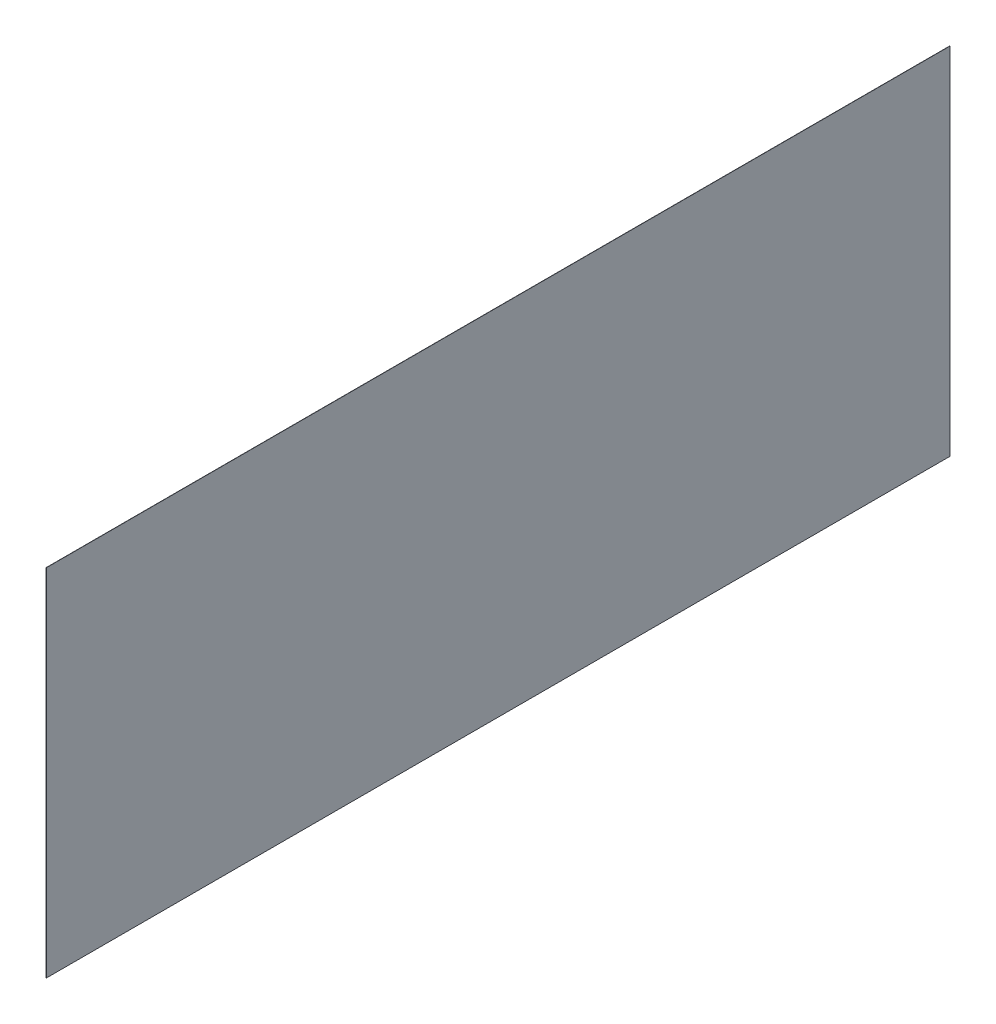
ISO-10303-21;
HEADER;
FILE_DESCRIPTION(('STEP AP214'),'2;1');
FILE_NAME('part.step','',(''),(''),'','','');
FILE_SCHEMA(('AUTOMOTIVE_DESIGN { 1 0 10303 214 1 1 1 1 }'));
ENDSEC;
DATA;
#1=APPLICATION_CONTEXT('core data for automotive mechanical design processes');
#2=APPLICATION_PROTOCOL_DEFINITION('international standard','automotive_design',2000,#1);
#3=PRODUCT_CONTEXT('',#1,'mechanical');
#4=PRODUCT('Part','Part','',(#3));
#5=PRODUCT_RELATED_PRODUCT_CATEGORY('part','',(#4));
#6=PRODUCT_DEFINITION_FORMATION('','',#4);
#7=PRODUCT_DEFINITION_CONTEXT('part definition',#1,'design');
#8=PRODUCT_DEFINITION('design','',#6,#7);
#9=PRODUCT_DEFINITION_SHAPE('','',#8);
#10=(LENGTH_UNIT() NAMED_UNIT(*) SI_UNIT(.MILLI.,.METRE.));
#11=(NAMED_UNIT(*) PLANE_ANGLE_UNIT() SI_UNIT($,.RADIAN.));
#12=(NAMED_UNIT(*) SI_UNIT($,.STERADIAN.) SOLID_ANGLE_UNIT());
#13=UNCERTAINTY_MEASURE_WITH_UNIT(LENGTH_MEASURE(1.E-05),#10,'distance_accuracy_value','');
#14=(GEOMETRIC_REPRESENTATION_CONTEXT(3) GLOBAL_UNCERTAINTY_ASSIGNED_CONTEXT((#13)) GLOBAL_UNIT_ASSIGNED_CONTEXT((#10,
#11,#12)) REPRESENTATION_CONTEXT('',''));
#15=CARTESIAN_POINT('',(0.,0.,0.));
#16=DIRECTION('',(0.,0.,1.));
#17=DIRECTION('',(1.,0.,0.));
#18=AXIS2_PLACEMENT_3D('',#15,#16,#17);
#19=CARTESIAN_POINT('',(-126.4032,60.,-150.));
#20=DIRECTION('',(0.,0.,-1.));
#21=DIRECTION('',(-1.,0.,0.));
#22=AXIS2_PLACEMENT_3D('',#19,#20,#21);
#23=PLANE('',#22);
#24=DIRECTION('',(1.,0.,0.));
#25=VECTOR('',#24,1.);
#26=CARTESIAN_POINT('',(-136.327,58.,-150.));
#27=LINE('',#26,#25);
#28=CARTESIAN_POINT('',(-126.4032,58.,-150.));
#29=VERTEX_POINT('',#28);
#30=CARTESIAN_POINT('',(-126.327,58.,-150.));
#31=VERTEX_POINT('',#30);
#32=EDGE_CURVE('E104',#29,#31,#27,.T.);
#33=ORIENTED_EDGE('',*,*,#32,.T.);
#34=DIRECTION('',(0.,1.,0.));
#35=VECTOR('',#34,1.);
#36=CARTESIAN_POINT('',(-126.327,60.,-150.));
#37=LINE('',#36,#35);
#38=CARTESIAN_POINT('',(-126.327,-60.,-150.));
#39=VERTEX_POINT('',#38);
#40=EDGE_CURVE('E96',#39,#31,#37,.T.);
#41=ORIENTED_EDGE('',*,*,#40,.F.);
#42=DIRECTION('',(1.,0.,0.));
#43=VECTOR('',#42,1.);
#44=CARTESIAN_POINT('',(-126.4032,-60.,-150.));
#45=LINE('',#44,#43);
#46=CARTESIAN_POINT('',(-126.4032,-60.,-150.));
#47=VERTEX_POINT('',#46);
#48=EDGE_CURVE('E11',#47,#39,#45,.T.);
#49=ORIENTED_EDGE('',*,*,#48,.F.);
#50=DIRECTION('',(0.,1.,0.));
#51=VECTOR('',#50,1.);
#52=CARTESIAN_POINT('',(-126.4032,60.,-150.));
#53=LINE('',#52,#51);
#54=EDGE_CURVE('E114',#47,#29,#53,.T.);
#55=ORIENTED_EDGE('',*,*,#54,.T.);
#56=EDGE_LOOP('',(#33,#41,#49,#55));
#57=FACE_BOUND('',#56,.T.);
#58=ADVANCED_FACE('F50',(#57),#23,.T.);
#59=CARTESIAN_POINT('',(-126.4032,-60.,150.));
#60=DIRECTION('',(0.,-1.,0.));
#61=DIRECTION('',(0.,0.,-1.));
#62=AXIS2_PLACEMENT_3D('',#59,#60,#61);
#63=PLANE('',#62);
#64=DIRECTION('',(0.,0.,-1.));
#65=VECTOR('',#64,1.);
#66=CARTESIAN_POINT('',(-126.327,-60.,150.));
#67=LINE('',#66,#65);
#68=CARTESIAN_POINT('',(-126.327,-60.,150.));
#69=VERTEX_POINT('',#68);
#70=EDGE_CURVE('E88',#69,#39,#67,.T.);
#71=ORIENTED_EDGE('',*,*,#70,.F.);
#72=DIRECTION('',(1.,0.,0.));
#73=VECTOR('',#72,1.);
#74=CARTESIAN_POINT('',(-126.4032,-60.,150.));
#75=LINE('',#74,#73);
#76=CARTESIAN_POINT('',(-126.4032,-60.,150.));
#77=VERTEX_POINT('',#76);
#78=EDGE_CURVE('E54',#77,#69,#75,.T.);
#79=ORIENTED_EDGE('',*,*,#78,.F.);
#80=DIRECTION('',(0.,0.,-1.));
#81=VECTOR('',#80,1.);
#82=CARTESIAN_POINT('',(-126.4032,-60.,150.));
#83=LINE('',#82,#81);
#84=EDGE_CURVE('E90',#77,#47,#83,.T.);
#85=ORIENTED_EDGE('',*,*,#84,.T.);
#86=ORIENTED_EDGE('',*,*,#48,.T.);
#87=EDGE_LOOP('',(#71,#79,#85,#86));
#88=FACE_BOUND('',#87,.T.);
#89=ADVANCED_FACE('F86',(#88),#63,.T.);
#90=CARTESIAN_POINT('',(-126.4032,60.,150.));
#91=DIRECTION('',(0.,0.,1.));
#92=DIRECTION('',(1.,0.,0.));
#93=AXIS2_PLACEMENT_3D('',#90,#91,#92);
#94=PLANE('',#93);
#95=DIRECTION('',(1.,0.,0.));
#96=VECTOR('',#95,1.);
#97=CARTESIAN_POINT('',(-136.327,58.,150.));
#98=LINE('',#97,#96);
#99=CARTESIAN_POINT('',(-126.4032,58.,150.));
#100=VERTEX_POINT('',#99);
#101=CARTESIAN_POINT('',(-126.327,58.,150.));
#102=VERTEX_POINT('',#101);
#103=EDGE_CURVE('E66',#100,#102,#98,.T.);
#104=ORIENTED_EDGE('',*,*,#103,.F.);
#105=DIRECTION('',(0.,-1.,0.));
#106=VECTOR('',#105,1.);
#107=CARTESIAN_POINT('',(-126.4032,60.,150.));
#108=LINE('',#107,#106);
#109=EDGE_CURVE('E106',#100,#77,#108,.T.);
#110=ORIENTED_EDGE('',*,*,#109,.T.);
#111=ORIENTED_EDGE('',*,*,#78,.T.);
#112=DIRECTION('',(0.,-1.,0.));
#113=VECTOR('',#112,1.);
#114=CARTESIAN_POINT('',(-126.327,60.,150.));
#115=LINE('',#114,#113);
#116=EDGE_CURVE('E98',#102,#69,#115,.T.);
#117=ORIENTED_EDGE('',*,*,#116,.F.);
#118=EDGE_LOOP('',(#104,#110,#111,#117));
#119=FACE_BOUND('',#118,.T.);
#120=ADVANCED_FACE('F52',(#119),#94,.T.);
#121=CARTESIAN_POINT('',(-126.4032,0.,0.));
#122=DIRECTION('',(-1.,0.,0.));
#123=DIRECTION('',(0.,0.,1.));
#124=AXIS2_PLACEMENT_3D('',#121,#122,#123);
#125=PLANE('',#124);
#126=DIRECTION('',(0.,0.,1.));
#127=VECTOR('',#126,1.);
#128=CARTESIAN_POINT('',(-126.4032,58.,0.));
#129=LINE('',#128,#127);
#130=EDGE_CURVE('E113',#29,#100,#129,.T.);
#131=ORIENTED_EDGE('',*,*,#130,.F.);
#132=ORIENTED_EDGE('',*,*,#54,.F.);
#133=ORIENTED_EDGE('',*,*,#84,.F.);
#134=ORIENTED_EDGE('',*,*,#109,.F.);
#135=EDGE_LOOP('',(#131,#132,#133,#134));
#136=FACE_BOUND('',#135,.T.);
#137=ADVANCED_FACE('F135',(#136),#125,.T.);
#138=CARTESIAN_POINT('',(-126.327,0.,0.));
#139=DIRECTION('',(-1.,0.,0.));
#140=DIRECTION('',(0.,0.,1.));
#141=AXIS2_PLACEMENT_3D('',#138,#139,#140);
#142=PLANE('',#141);
#143=ORIENTED_EDGE('',*,*,#40,.T.);
#144=DIRECTION('',(0.,0.,-1.));
#145=VECTOR('',#144,1.);
#146=CARTESIAN_POINT('',(-126.327,58.,150.));
#147=LINE('',#146,#145);
#148=EDGE_CURVE('E123',#102,#31,#147,.T.);
#149=ORIENTED_EDGE('',*,*,#148,.F.);
#150=ORIENTED_EDGE('',*,*,#116,.T.);
#151=ORIENTED_EDGE('',*,*,#70,.T.);
#152=EDGE_LOOP('',(#143,#149,#150,#151));
#153=FACE_BOUND('',#152,.T.);
#154=ADVANCED_FACE('F94',(#153),#142,.F.);
#155=CARTESIAN_POINT('',(-136.327,58.,150.));
#156=DIRECTION('',(0.,-1.,0.));
#157=DIRECTION('',(0.,0.,-1.));
#158=AXIS2_PLACEMENT_3D('',#155,#156,#157);
#159=PLANE('',#158);
#160=ORIENTED_EDGE('',*,*,#130,.T.);
#161=ORIENTED_EDGE('',*,*,#103,.T.);
#162=ORIENTED_EDGE('',*,*,#148,.T.);
#163=ORIENTED_EDGE('',*,*,#32,.F.);
#164=EDGE_LOOP('',(#160,#161,#162,#163));
#165=FACE_BOUND('',#164,.T.);
#166=ADVANCED_FACE('F127',(#165),#159,.F.);
#167=CLOSED_SHELL('',(#58,#89,#120,#137,#154,#166));
#168=MANIFOLD_SOLID_BREP('B2',#167);
#169=ADVANCED_BREP_SHAPE_REPRESENTATION('',(#18,#168),#14);
#170=SHAPE_DEFINITION_REPRESENTATION(#9,#169);
ENDSEC;
END-ISO-10303-21;
